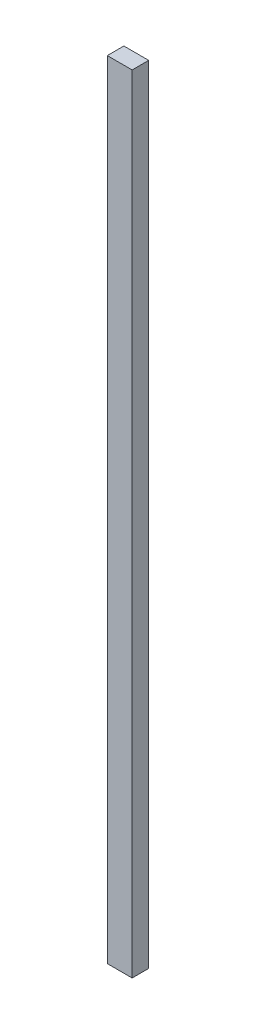
ISO-10303-21;
HEADER;
FILE_DESCRIPTION(('STEP AP214'),'2;1');
FILE_NAME('part.step','',(''),(''),'','','');
FILE_SCHEMA(('AUTOMOTIVE_DESIGN { 1 0 10303 214 1 1 1 1 }'));
ENDSEC;
DATA;
#1=APPLICATION_CONTEXT('core data for automotive mechanical design processes');
#2=APPLICATION_PROTOCOL_DEFINITION('international standard','automotive_design',2000,#1);
#3=PRODUCT_CONTEXT('',#1,'mechanical');
#4=PRODUCT('Part','Part','',(#3));
#5=PRODUCT_RELATED_PRODUCT_CATEGORY('part','',(#4));
#6=PRODUCT_DEFINITION_FORMATION('','',#4);
#7=PRODUCT_DEFINITION_CONTEXT('part definition',#1,'design');
#8=PRODUCT_DEFINITION('design','',#6,#7);
#9=PRODUCT_DEFINITION_SHAPE('','',#8);
#10=(LENGTH_UNIT() NAMED_UNIT(*) SI_UNIT(.MILLI.,.METRE.));
#11=(NAMED_UNIT(*) PLANE_ANGLE_UNIT() SI_UNIT($,.RADIAN.));
#12=(NAMED_UNIT(*) SI_UNIT($,.STERADIAN.) SOLID_ANGLE_UNIT());
#13=UNCERTAINTY_MEASURE_WITH_UNIT(LENGTH_MEASURE(1.E-05),#10,'distance_accuracy_value','');
#14=(GEOMETRIC_REPRESENTATION_CONTEXT(3) GLOBAL_UNCERTAINTY_ASSIGNED_CONTEXT((#13)) GLOBAL_UNIT_ASSIGNED_CONTEXT((#10,
#11,#12)) REPRESENTATION_CONTEXT('',''));
#15=CARTESIAN_POINT('',(0.,0.,0.));
#16=DIRECTION('',(0.,0.,1.));
#17=DIRECTION('',(1.,0.,0.));
#18=AXIS2_PLACEMENT_3D('',#15,#16,#17);
#19=CARTESIAN_POINT('',(-5.99999999999992,604.131527045301,-46.0999999999999));
#20=DIRECTION('',(1.,0.,0.));
#21=DIRECTION('',(0.,1.,0.));
#22=AXIS2_PLACEMENT_3D('',#19,#20,#21);
#23=PLANE('',#22);
#24=DIRECTION('',(0.,1.,0.));
#25=VECTOR('',#24,1.);
#26=CARTESIAN_POINT('',(-5.99999999999992,604.131527045301,-38.0999999999999));
#27=LINE('',#26,#25);
#28=CARTESIAN_POINT('',(-6.00000000000003,224.631527045149,-38.1));
#29=VERTEX_POINT('',#28);
#30=CARTESIAN_POINT('',(-5.99999999999992,604.131527045301,-38.0999999999999));
#31=VERTEX_POINT('',#30);
#32=EDGE_CURVE('E96',#29,#31,#27,.T.);
#33=ORIENTED_EDGE('',*,*,#32,.T.);
#34=DIRECTION('',(0.,0.,1.));
#35=VECTOR('',#34,1.);
#36=CARTESIAN_POINT('',(-5.99999999999992,604.131527045301,-46.0999999999999));
#37=LINE('',#36,#35);
#38=CARTESIAN_POINT('',(-5.99999999999992,604.131527045301,-46.0999999999999));
#39=VERTEX_POINT('',#38);
#40=EDGE_CURVE('E11',#39,#31,#37,.T.);
#41=ORIENTED_EDGE('',*,*,#40,.F.);
#42=DIRECTION('',(0.,1.,0.));
#43=VECTOR('',#42,1.);
#44=CARTESIAN_POINT('',(-5.99999999999992,604.131527045301,-46.0999999999999));
#45=LINE('',#44,#43);
#46=CARTESIAN_POINT('',(-6.00000000000003,224.631527045149,-46.1));
#47=VERTEX_POINT('',#46);
#48=EDGE_CURVE('E84',#47,#39,#45,.T.);
#49=ORIENTED_EDGE('',*,*,#48,.F.);
#50=DIRECTION('',(0.,0.,1.));
#51=VECTOR('',#50,1.);
#52=CARTESIAN_POINT('',(-6.00000000000003,224.631527045149,-46.1));
#53=LINE('',#52,#51);
#54=EDGE_CURVE('E92',#47,#29,#53,.T.);
#55=ORIENTED_EDGE('',*,*,#54,.T.);
#56=EDGE_LOOP('',(#33,#41,#49,#55));
#57=FACE_BOUND('',#56,.T.);
#58=ADVANCED_FACE('F33',(#57),#23,.F.);
#59=CARTESIAN_POINT('',(6.00000000000008,604.131527045301,-46.0999999999999));
#60=DIRECTION('',(0.,-1.,0.));
#61=DIRECTION('',(0.,0.,-1.));
#62=AXIS2_PLACEMENT_3D('',#59,#60,#61);
#63=PLANE('',#62);
#64=DIRECTION('',(1.,0.,0.));
#65=VECTOR('',#64,1.);
#66=CARTESIAN_POINT('',(6.00000000000008,604.131527045301,-38.0999999999999));
#67=LINE('',#66,#65);
#68=CARTESIAN_POINT('',(6.00000000000008,604.131527045301,-38.0999999999999));
#69=VERTEX_POINT('',#68);
#70=EDGE_CURVE('E88',#31,#69,#67,.T.);
#71=ORIENTED_EDGE('',*,*,#70,.T.);
#72=DIRECTION('',(0.,0.,1.));
#73=VECTOR('',#72,1.);
#74=CARTESIAN_POINT('',(6.00000000000008,604.131527045301,-46.0999999999999));
#75=LINE('',#74,#73);
#76=CARTESIAN_POINT('',(6.00000000000008,604.131527045301,-46.0999999999999));
#77=VERTEX_POINT('',#76);
#78=EDGE_CURVE('E41',#77,#69,#75,.T.);
#79=ORIENTED_EDGE('',*,*,#78,.F.);
#80=DIRECTION('',(1.,0.,0.));
#81=VECTOR('',#80,1.);
#82=CARTESIAN_POINT('',(6.00000000000008,604.131527045301,-46.0999999999999));
#83=LINE('',#82,#81);
#84=EDGE_CURVE('E79',#39,#77,#83,.T.);
#85=ORIENTED_EDGE('',*,*,#84,.F.);
#86=ORIENTED_EDGE('',*,*,#40,.T.);
#87=EDGE_LOOP('',(#71,#79,#85,#86));
#88=FACE_BOUND('',#87,.T.);
#89=ADVANCED_FACE('F87',(#88),#63,.F.);
#90=CARTESIAN_POINT('',(6.00000000000008,604.131527045301,-46.0999999999999));
#91=DIRECTION('',(-1.,0.,0.));
#92=DIRECTION('',(0.,-1.,0.));
#93=AXIS2_PLACEMENT_3D('',#90,#91,#92);
#94=PLANE('',#93);
#95=DIRECTION('',(0.,-1.,0.));
#96=VECTOR('',#95,1.);
#97=CARTESIAN_POINT('',(6.00000000000008,604.131527045301,-38.0999999999999));
#98=LINE('',#97,#96);
#99=CARTESIAN_POINT('',(5.99999999999997,224.631527045149,-38.1));
#100=VERTEX_POINT('',#99);
#101=EDGE_CURVE('E66',#69,#100,#98,.T.);
#102=ORIENTED_EDGE('',*,*,#101,.T.);
#103=DIRECTION('',(0.,0.,1.));
#104=VECTOR('',#103,1.);
#105=CARTESIAN_POINT('',(5.99999999999997,224.631527045149,-46.1));
#106=LINE('',#105,#104);
#107=CARTESIAN_POINT('',(5.99999999999997,224.631527045149,-46.1));
#108=VERTEX_POINT('',#107);
#109=EDGE_CURVE('E89',#108,#100,#106,.T.);
#110=ORIENTED_EDGE('',*,*,#109,.F.);
#111=DIRECTION('',(0.,-1.,0.));
#112=VECTOR('',#111,1.);
#113=CARTESIAN_POINT('',(6.00000000000008,604.131527045301,-46.0999999999999));
#114=LINE('',#113,#112);
#115=EDGE_CURVE('E82',#77,#108,#114,.T.);
#116=ORIENTED_EDGE('',*,*,#115,.F.);
#117=ORIENTED_EDGE('',*,*,#78,.T.);
#118=EDGE_LOOP('',(#102,#110,#116,#117));
#119=FACE_BOUND('',#118,.T.);
#120=ADVANCED_FACE('F90',(#119),#94,.F.);
#121=CARTESIAN_POINT('',(5.99999999999997,224.631527045149,-46.1));
#122=DIRECTION('',(0.,1.,0.));
#123=DIRECTION('',(0.,0.,1.));
#124=AXIS2_PLACEMENT_3D('',#121,#122,#123);
#125=PLANE('',#124);
#126=DIRECTION('',(-1.,0.,0.));
#127=VECTOR('',#126,1.);
#128=CARTESIAN_POINT('',(5.99999999999997,224.631527045149,-38.1));
#129=LINE('',#128,#127);
#130=EDGE_CURVE('E72',#100,#29,#129,.T.);
#131=ORIENTED_EDGE('',*,*,#130,.T.);
#132=ORIENTED_EDGE('',*,*,#54,.F.);
#133=DIRECTION('',(-1.,0.,0.));
#134=VECTOR('',#133,1.);
#135=CARTESIAN_POINT('',(5.99999999999997,224.631527045149,-46.1));
#136=LINE('',#135,#134);
#137=EDGE_CURVE('E49',#108,#47,#136,.T.);
#138=ORIENTED_EDGE('',*,*,#137,.F.);
#139=ORIENTED_EDGE('',*,*,#109,.T.);
#140=EDGE_LOOP('',(#131,#132,#138,#139));
#141=FACE_BOUND('',#140,.T.);
#142=ADVANCED_FACE('F103',(#141),#125,.F.);
#143=CARTESIAN_POINT('',(0.,0.,-46.1));
#144=DIRECTION('',(0.,0.,-1.));
#145=DIRECTION('',(0.,1.,0.));
#146=AXIS2_PLACEMENT_3D('',#143,#144,#145);
#147=PLANE('',#146);
#148=ORIENTED_EDGE('',*,*,#48,.T.);
#149=ORIENTED_EDGE('',*,*,#84,.T.);
#150=ORIENTED_EDGE('',*,*,#115,.T.);
#151=ORIENTED_EDGE('',*,*,#137,.T.);
#152=EDGE_LOOP('',(#148,#149,#150,#151));
#153=FACE_BOUND('',#152,.T.);
#154=ADVANCED_FACE('F80',(#153),#147,.T.);
#155=CARTESIAN_POINT('',(0.,0.,-38.1));
#156=DIRECTION('',(0.,0.,-1.));
#157=DIRECTION('',(0.,1.,0.));
#158=AXIS2_PLACEMENT_3D('',#155,#156,#157);
#159=PLANE('',#158);
#160=ORIENTED_EDGE('',*,*,#32,.F.);
#161=ORIENTED_EDGE('',*,*,#130,.F.);
#162=ORIENTED_EDGE('',*,*,#101,.F.);
#163=ORIENTED_EDGE('',*,*,#70,.F.);
#164=EDGE_LOOP('',(#160,#161,#162,#163));
#165=FACE_BOUND('',#164,.T.);
#166=ADVANCED_FACE('F106',(#165),#159,.F.);
#167=CLOSED_SHELL('',(#58,#89,#120,#142,#154,#166));
#168=MANIFOLD_SOLID_BREP('B2',#167);
#169=ADVANCED_BREP_SHAPE_REPRESENTATION('',(#18,#168),#14);
#170=SHAPE_DEFINITION_REPRESENTATION(#9,#169);
ENDSEC;
END-ISO-10303-21;
